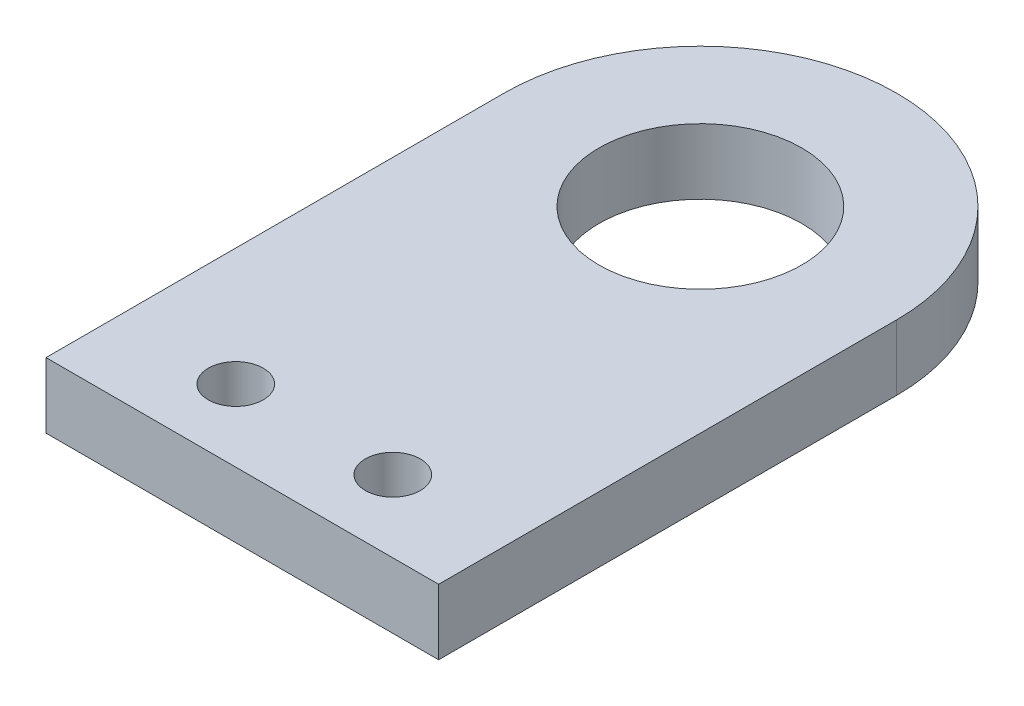
ISO-10303-21;
HEADER;
FILE_DESCRIPTION(('STEP AP214'),'2;1');
FILE_NAME('part.step','',(''),(''),'','','');
FILE_SCHEMA(('AUTOMOTIVE_DESIGN { 1 0 10303 214 1 1 1 1 }'));
ENDSEC;
DATA;
#1=APPLICATION_CONTEXT('core data for automotive mechanical design processes');
#2=APPLICATION_PROTOCOL_DEFINITION('international standard','automotive_design',2000,#1);
#3=PRODUCT_CONTEXT('',#1,'mechanical');
#4=PRODUCT('Part','Part','',(#3));
#5=PRODUCT_RELATED_PRODUCT_CATEGORY('part','',(#4));
#6=PRODUCT_DEFINITION_FORMATION('','',#4);
#7=PRODUCT_DEFINITION_CONTEXT('part definition',#1,'design');
#8=PRODUCT_DEFINITION('design','',#6,#7);
#9=PRODUCT_DEFINITION_SHAPE('','',#8);
#10=(LENGTH_UNIT() NAMED_UNIT(*) SI_UNIT(.MILLI.,.METRE.));
#11=(NAMED_UNIT(*) PLANE_ANGLE_UNIT() SI_UNIT($,.RADIAN.));
#12=(NAMED_UNIT(*) SI_UNIT($,.STERADIAN.) SOLID_ANGLE_UNIT());
#13=UNCERTAINTY_MEASURE_WITH_UNIT(LENGTH_MEASURE(1.E-05),#10,'distance_accuracy_value','');
#14=(GEOMETRIC_REPRESENTATION_CONTEXT(3) GLOBAL_UNCERTAINTY_ASSIGNED_CONTEXT((#13)) GLOBAL_UNIT_ASSIGNED_CONTEXT((#10,
#11,#12)) REPRESENTATION_CONTEXT('',''));
#15=CARTESIAN_POINT('',(0.,0.,0.));
#16=DIRECTION('',(0.,0.,1.));
#17=DIRECTION('',(1.,0.,0.));
#18=AXIS2_PLACEMENT_3D('',#15,#16,#17);
#19=CARTESIAN_POINT('',(15.,5.,0.));
#20=DIRECTION('',(-1.,0.,0.));
#21=DIRECTION('',(0.,0.,1.));
#22=AXIS2_PLACEMENT_3D('',#19,#20,#21);
#23=PLANE('',#22);
#24=DIRECTION('',(0.,0.,-1.));
#25=VECTOR('',#24,1.);
#26=CARTESIAN_POINT('',(15.,0.,0.));
#27=LINE('',#26,#25);
#28=CARTESIAN_POINT('',(15.,0.,0.));
#29=VERTEX_POINT('',#28);
#30=CARTESIAN_POINT('',(15.,0.,-35.));
#31=VERTEX_POINT('',#30);
#32=EDGE_CURVE('E118',#29,#31,#27,.T.);
#33=ORIENTED_EDGE('',*,*,#32,.T.);
#34=DIRECTION('',(0.,-1.,0.));
#35=VECTOR('',#34,1.);
#36=CARTESIAN_POINT('',(15.,5.,-35.));
#37=LINE('',#36,#35);
#38=CARTESIAN_POINT('',(15.,5.,-35.));
#39=VERTEX_POINT('',#38);
#40=EDGE_CURVE('E11',#39,#31,#37,.T.);
#41=ORIENTED_EDGE('',*,*,#40,.F.);
#42=DIRECTION('',(0.,0.,-1.));
#43=VECTOR('',#42,1.);
#44=CARTESIAN_POINT('',(15.,5.,0.));
#45=LINE('',#44,#43);
#46=CARTESIAN_POINT('',(15.,5.,0.));
#47=VERTEX_POINT('',#46);
#48=EDGE_CURVE('E94',#47,#39,#45,.T.);
#49=ORIENTED_EDGE('',*,*,#48,.F.);
#50=DIRECTION('',(0.,-1.,0.));
#51=VECTOR('',#50,1.);
#52=CARTESIAN_POINT('',(15.,5.,0.));
#53=LINE('',#52,#51);
#54=EDGE_CURVE('E114',#47,#29,#53,.T.);
#55=ORIENTED_EDGE('',*,*,#54,.T.);
#56=EDGE_LOOP('',(#33,#41,#49,#55));
#57=FACE_BOUND('',#56,.T.);
#58=ADVANCED_FACE('F45',(#57),#23,.F.);
#59=CARTESIAN_POINT('',(0.,5.,-35.));
#60=DIRECTION('',(0.,-1.,0.));
#61=DIRECTION('',(0.,0.,-1.));
#62=AXIS2_PLACEMENT_3D('',#59,#60,#61);
#63=CYLINDRICAL_SURFACE('',#62,15.);
#64=CARTESIAN_POINT('',(0.,0.,-35.));
#65=DIRECTION('',(0.,1.,0.));
#66=DIRECTION('',(0.,0.,1.));
#67=AXIS2_PLACEMENT_3D('',#64,#65,#66);
#68=CIRCLE('',#67,15.);
#69=CARTESIAN_POINT('',(-15.,0.,-35.));
#70=VERTEX_POINT('',#69);
#71=EDGE_CURVE('E99',#31,#70,#68,.T.);
#72=ORIENTED_EDGE('',*,*,#71,.T.);
#73=DIRECTION('',(0.,-1.,0.));
#74=VECTOR('',#73,1.);
#75=CARTESIAN_POINT('',(-15.,5.,-35.));
#76=LINE('',#75,#74);
#77=CARTESIAN_POINT('',(-15.,5.,-35.));
#78=VERTEX_POINT('',#77);
#79=EDGE_CURVE('E54',#78,#70,#76,.T.);
#80=ORIENTED_EDGE('',*,*,#79,.F.);
#81=CARTESIAN_POINT('',(0.,5.,-35.));
#82=DIRECTION('',(0.,1.,0.));
#83=DIRECTION('',(0.,0.,1.));
#84=AXIS2_PLACEMENT_3D('',#81,#82,#83);
#85=CIRCLE('',#84,15.);
#86=EDGE_CURVE('E88',#39,#78,#85,.T.);
#87=ORIENTED_EDGE('',*,*,#86,.F.);
#88=ORIENTED_EDGE('',*,*,#40,.T.);
#89=EDGE_LOOP('',(#72,#80,#87,#88));
#90=FACE_BOUND('',#89,.T.);
#91=ADVANCED_FACE('F98',(#90),#63,.T.);
#92=CARTESIAN_POINT('',(-15.,5.,0.));
#93=DIRECTION('',(-1.,0.,0.));
#94=DIRECTION('',(0.,0.,1.));
#95=AXIS2_PLACEMENT_3D('',#92,#93,#94);
#96=PLANE('',#95);
#97=DIRECTION('',(0.,0.,-1.));
#98=VECTOR('',#97,1.);
#99=CARTESIAN_POINT('',(-15.,0.,0.));
#100=LINE('',#99,#98);
#101=CARTESIAN_POINT('',(-15.,0.,0.));
#102=VERTEX_POINT('',#101);
#103=EDGE_CURVE('E122',#102,#70,#100,.T.);
#104=ORIENTED_EDGE('',*,*,#103,.F.);
#105=DIRECTION('',(0.,-1.,0.));
#106=VECTOR('',#105,1.);
#107=CARTESIAN_POINT('',(-15.,5.,0.));
#108=LINE('',#107,#106);
#109=CARTESIAN_POINT('',(-15.,5.,0.));
#110=VERTEX_POINT('',#109);
#111=EDGE_CURVE('E78',#110,#102,#108,.T.);
#112=ORIENTED_EDGE('',*,*,#111,.F.);
#113=DIRECTION('',(0.,0.,-1.));
#114=VECTOR('',#113,1.);
#115=CARTESIAN_POINT('',(-15.,5.,0.));
#116=LINE('',#115,#114);
#117=EDGE_CURVE('E92',#110,#78,#116,.T.);
#118=ORIENTED_EDGE('',*,*,#117,.T.);
#119=ORIENTED_EDGE('',*,*,#79,.T.);
#120=EDGE_LOOP('',(#104,#112,#118,#119));
#121=FACE_BOUND('',#120,.T.);
#122=ADVANCED_FACE('F103',(#121),#96,.T.);
#123=CARTESIAN_POINT('',(-6.,5.,-5.5));
#124=DIRECTION('',(0.,-1.,0.));
#125=DIRECTION('',(0.,0.,-1.));
#126=AXIS2_PLACEMENT_3D('',#123,#124,#125);
#127=CYLINDRICAL_SURFACE('',#126,2.1);
#128=CARTESIAN_POINT('',(-6.,5.,-5.5));
#129=DIRECTION('',(0.,1.,0.));
#130=DIRECTION('',(0.,0.,1.));
#131=AXIS2_PLACEMENT_3D('',#128,#129,#130);
#132=CIRCLE('',#131,2.1);
#133=CARTESIAN_POINT('',(-6.,5.,-3.4));
#134=VERTEX_POINT('',#133);
#135=EDGE_CURVE('E105',#134,#134,#132,.T.);
#136=ORIENTED_EDGE('',*,*,#135,.T.);
#137=EDGE_LOOP('',(#136));
#138=FACE_BOUND('',#137,.T.);
#139=CARTESIAN_POINT('',(-6.,0.,-5.5));
#140=DIRECTION('',(0.,1.,0.));
#141=DIRECTION('',(0.,0.,1.));
#142=AXIS2_PLACEMENT_3D('',#139,#140,#141);
#143=CIRCLE('',#142,2.1);
#144=CARTESIAN_POINT('',(-6.,0.,-3.4));
#145=VERTEX_POINT('',#144);
#146=EDGE_CURVE('E125',#145,#145,#143,.T.);
#147=ORIENTED_EDGE('',*,*,#146,.F.);
#148=EDGE_LOOP('',(#147));
#149=FACE_BOUND('',#148,.T.);
#150=ADVANCED_FACE('F167',(#138,#149),#127,.F.);
#151=CARTESIAN_POINT('',(0.,5.,0.));
#152=DIRECTION('',(0.,0.,-1.));
#153=DIRECTION('',(-1.,0.,0.));
#154=AXIS2_PLACEMENT_3D('',#151,#152,#153);
#155=PLANE('',#154);
#156=DIRECTION('',(1.,0.,0.));
#157=VECTOR('',#156,1.);
#158=CARTESIAN_POINT('',(0.,0.,0.));
#159=LINE('',#158,#157);
#160=EDGE_CURVE('E81',#102,#29,#159,.T.);
#161=ORIENTED_EDGE('',*,*,#160,.T.);
#162=ORIENTED_EDGE('',*,*,#54,.F.);
#163=DIRECTION('',(1.,0.,0.));
#164=VECTOR('',#163,1.);
#165=CARTESIAN_POINT('',(0.,5.,0.));
#166=LINE('',#165,#164);
#167=EDGE_CURVE('E62',#110,#47,#166,.T.);
#168=ORIENTED_EDGE('',*,*,#167,.F.);
#169=ORIENTED_EDGE('',*,*,#111,.T.);
#170=EDGE_LOOP('',(#161,#162,#168,#169));
#171=FACE_BOUND('',#170,.T.);
#172=ADVANCED_FACE('F155',(#171),#155,.F.);
#173=CARTESIAN_POINT('',(0.,5.,-35.));
#174=DIRECTION('',(0.,-1.,0.));
#175=DIRECTION('',(0.,0.,-1.));
#176=AXIS2_PLACEMENT_3D('',#173,#174,#175);
#177=CYLINDRICAL_SURFACE('',#176,7.75);
#178=CARTESIAN_POINT('',(0.,5.,-35.));
#179=DIRECTION('',(0.,1.,0.));
#180=DIRECTION('',(0.,0.,1.));
#181=AXIS2_PLACEMENT_3D('',#178,#179,#180);
#182=CIRCLE('',#181,7.75);
#183=CARTESIAN_POINT('',(0.,5.,-27.25));
#184=VERTEX_POINT('',#183);
#185=EDGE_CURVE('E131',#184,#184,#182,.T.);
#186=ORIENTED_EDGE('',*,*,#185,.T.);
#187=EDGE_LOOP('',(#186));
#188=FACE_BOUND('',#187,.T.);
#189=CARTESIAN_POINT('',(0.,0.,-35.));
#190=DIRECTION('',(0.,1.,0.));
#191=DIRECTION('',(0.,0.,1.));
#192=AXIS2_PLACEMENT_3D('',#189,#190,#191);
#193=CIRCLE('',#192,7.75);
#194=CARTESIAN_POINT('',(0.,0.,-27.25));
#195=VERTEX_POINT('',#194);
#196=EDGE_CURVE('E115',#195,#195,#193,.T.);
#197=ORIENTED_EDGE('',*,*,#196,.F.);
#198=EDGE_LOOP('',(#197));
#199=FACE_BOUND('',#198,.T.);
#200=ADVANCED_FACE('F47',(#188,#199),#177,.F.);
#201=CARTESIAN_POINT('',(6.,5.,-5.5));
#202=DIRECTION('',(0.,-1.,0.));
#203=DIRECTION('',(0.,0.,-1.));
#204=AXIS2_PLACEMENT_3D('',#201,#202,#203);
#205=CYLINDRICAL_SURFACE('',#204,2.1);
#206=CARTESIAN_POINT('',(6.,5.,-5.5));
#207=DIRECTION('',(0.,1.,0.));
#208=DIRECTION('',(0.,0.,1.));
#209=AXIS2_PLACEMENT_3D('',#206,#207,#208);
#210=CIRCLE('',#209,2.1);
#211=CARTESIAN_POINT('',(6.,5.,-3.4));
#212=VERTEX_POINT('',#211);
#213=EDGE_CURVE('E111',#212,#212,#210,.F.);
#214=ORIENTED_EDGE('',*,*,#213,.F.);
#215=EDGE_LOOP('',(#214));
#216=FACE_BOUND('',#215,.T.);
#217=CARTESIAN_POINT('',(6.,0.,-5.5));
#218=DIRECTION('',(0.,1.,0.));
#219=DIRECTION('',(0.,0.,1.));
#220=AXIS2_PLACEMENT_3D('',#217,#218,#219);
#221=CIRCLE('',#220,2.1);
#222=CARTESIAN_POINT('',(6.,0.,-3.4));
#223=VERTEX_POINT('',#222);
#224=EDGE_CURVE('E128',#223,#223,#221,.F.);
#225=ORIENTED_EDGE('',*,*,#224,.T.);
#226=EDGE_LOOP('',(#225));
#227=FACE_BOUND('',#226,.T.);
#228=ADVANCED_FACE('F145',(#216,#227),#205,.F.);
#229=CARTESIAN_POINT('',(0.,5.,0.));
#230=DIRECTION('',(0.,1.,0.));
#231=DIRECTION('',(0.,0.,1.));
#232=AXIS2_PLACEMENT_3D('',#229,#230,#231);
#233=PLANE('',#232);
#234=ORIENTED_EDGE('',*,*,#185,.F.);
#235=EDGE_LOOP('',(#234));
#236=FACE_BOUND('',#235,.T.);
#237=ORIENTED_EDGE('',*,*,#48,.T.);
#238=ORIENTED_EDGE('',*,*,#86,.T.);
#239=ORIENTED_EDGE('',*,*,#117,.F.);
#240=ORIENTED_EDGE('',*,*,#167,.T.);
#241=EDGE_LOOP('',(#237,#238,#239,#240));
#242=FACE_BOUND('',#241,.T.);
#243=ORIENTED_EDGE('',*,*,#135,.F.);
#244=EDGE_LOOP('',(#243));
#245=FACE_BOUND('',#244,.T.);
#246=ORIENTED_EDGE('',*,*,#213,.T.);
#247=EDGE_LOOP('',(#246));
#248=FACE_BOUND('',#247,.T.);
#249=ADVANCED_FACE('F89',(#236,#242,#245,#248),#233,.T.);
#250=CARTESIAN_POINT('',(0.,0.,0.));
#251=DIRECTION('',(0.,1.,0.));
#252=DIRECTION('',(0.,0.,1.));
#253=AXIS2_PLACEMENT_3D('',#250,#251,#252);
#254=PLANE('',#253);
#255=ORIENTED_EDGE('',*,*,#196,.T.);
#256=EDGE_LOOP('',(#255));
#257=FACE_BOUND('',#256,.T.);
#258=ORIENTED_EDGE('',*,*,#32,.F.);
#259=ORIENTED_EDGE('',*,*,#160,.F.);
#260=ORIENTED_EDGE('',*,*,#103,.T.);
#261=ORIENTED_EDGE('',*,*,#71,.F.);
#262=EDGE_LOOP('',(#258,#259,#260,#261));
#263=FACE_BOUND('',#262,.T.);
#264=ORIENTED_EDGE('',*,*,#146,.T.);
#265=EDGE_LOOP('',(#264));
#266=FACE_BOUND('',#265,.T.);
#267=ORIENTED_EDGE('',*,*,#224,.F.);
#268=EDGE_LOOP('',(#267));
#269=FACE_BOUND('',#268,.T.);
#270=ADVANCED_FACE('F136',(#257,#263,#266,#269),#254,.F.);
#271=CLOSED_SHELL('',(#58,#91,#122,#150,#172,#200,#228,#249,#270));
#272=MANIFOLD_SOLID_BREP('B2',#271);
#273=ADVANCED_BREP_SHAPE_REPRESENTATION('',(#18,#272),#14);
#274=SHAPE_DEFINITION_REPRESENTATION(#9,#273);
ENDSEC;
END-ISO-10303-21;
